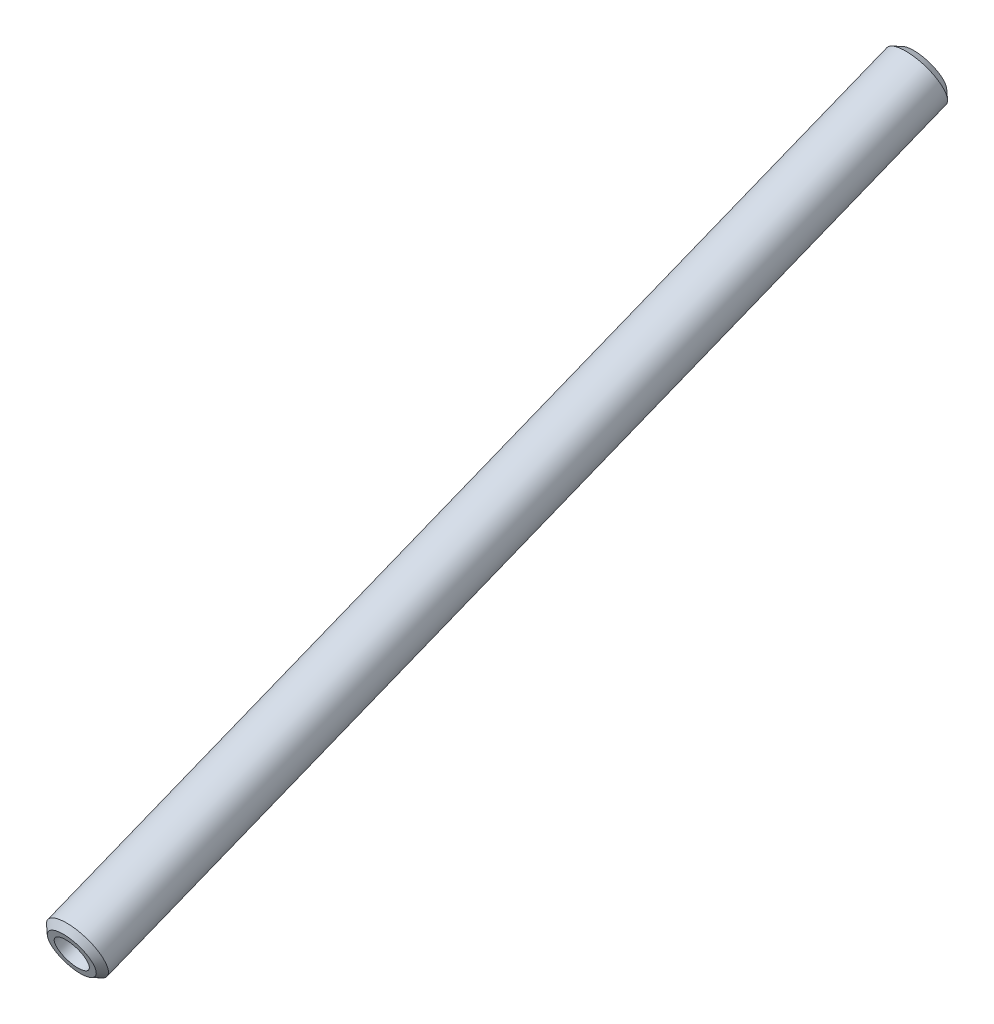
ISO-10303-21;
HEADER;
FILE_DESCRIPTION(('STEP AP214'),'2;1');
FILE_NAME('part.step','',(''),(''),'','','');
FILE_SCHEMA(('AUTOMOTIVE_DESIGN { 1 0 10303 214 1 1 1 1 }'));
ENDSEC;
DATA;
#1=APPLICATION_CONTEXT('core data for automotive mechanical design processes');
#2=APPLICATION_PROTOCOL_DEFINITION('international standard','automotive_design',2000,#1);
#3=PRODUCT_CONTEXT('',#1,'mechanical');
#4=PRODUCT('Part','Part','',(#3));
#5=PRODUCT_RELATED_PRODUCT_CATEGORY('part','',(#4));
#6=PRODUCT_DEFINITION_FORMATION('','',#4);
#7=PRODUCT_DEFINITION_CONTEXT('part definition',#1,'design');
#8=PRODUCT_DEFINITION('design','',#6,#7);
#9=PRODUCT_DEFINITION_SHAPE('','',#8);
#10=(LENGTH_UNIT() NAMED_UNIT(*) SI_UNIT(.MILLI.,.METRE.));
#11=(NAMED_UNIT(*) PLANE_ANGLE_UNIT() SI_UNIT($,.RADIAN.));
#12=(NAMED_UNIT(*) SI_UNIT($,.STERADIAN.) SOLID_ANGLE_UNIT());
#13=UNCERTAINTY_MEASURE_WITH_UNIT(LENGTH_MEASURE(1.E-05),#10,'distance_accuracy_value','');
#14=(GEOMETRIC_REPRESENTATION_CONTEXT(3) GLOBAL_UNCERTAINTY_ASSIGNED_CONTEXT((#13)) GLOBAL_UNIT_ASSIGNED_CONTEXT((#10,
#11,#12)) REPRESENTATION_CONTEXT('',''));
#15=CARTESIAN_POINT('',(0.,0.,0.));
#16=DIRECTION('',(0.,0.,1.));
#17=DIRECTION('',(1.,0.,0.));
#18=AXIS2_PLACEMENT_3D('',#15,#16,#17);
#19=CARTESIAN_POINT('',(1.75,14.1081767124824,62.1660185091115));
#20=DIRECTION('',(0.,0.371267808223223,-0.928525828707594));
#21=DIRECTION('',(0.,0.928525828707594,0.371267808223223));
#22=AXIS2_PLACEMENT_3D('',#19,#20,#21);
#23=PLANE('',#22);
#24=CARTESIAN_POINT('',(0.,14.1081767124825,62.1660185091115));
#25=DIRECTION('',(0.,-0.371267808223223,0.928525828707594));
#26=DIRECTION('',(0.,-0.928525828707594,-0.371267808223223));
#27=AXIS2_PLACEMENT_3D('',#24,#25,#26);
#28=CIRCLE('',#27,1.75);
#29=CARTESIAN_POINT('',(0.,12.4832565122442,61.5162998447208));
#30=VERTEX_POINT('',#29);
#31=EDGE_CURVE('E76',#30,#30,#28,.T.);
#32=ORIENTED_EDGE('',*,*,#31,.F.);
#33=EDGE_LOOP('',(#32));
#34=FACE_BOUND('',#33,.T.);
#35=CARTESIAN_POINT('',(0.,14.1081767124825,62.1660185091115));
#36=DIRECTION('',(0.,-0.371267808223223,0.928525828707594));
#37=DIRECTION('',(0.,-0.928525828707594,-0.371267808223223));
#38=AXIS2_PLACEMENT_3D('',#35,#36,#37);
#39=CIRCLE('',#38,2.7);
#40=CARTESIAN_POINT('',(0.,11.6011569749719,61.1635954269088));
#41=VERTEX_POINT('',#40);
#42=EDGE_CURVE('E55',#41,#41,#39,.T.);
#43=ORIENTED_EDGE('',*,*,#42,.T.);
#44=EDGE_LOOP('',(#43));
#45=FACE_BOUND('',#44,.T.);
#46=ADVANCED_FACE('F34',(#34,#45),#23,.F.);
#47=CARTESIAN_POINT('',(0.,0.,97.45));
#48=DIRECTION('',(0.,-0.371267808223223,0.928525828707594));
#49=DIRECTION('',(0.,-0.928525828707594,-0.371267808223223));
#50=AXIS2_PLACEMENT_3D('',#47,#48,#49);
#51=CYLINDRICAL_SURFACE('',#50,2.7);
#52=ORIENTED_EDGE('',*,*,#42,.F.);
#53=EDGE_LOOP('',(#52));
#54=FACE_BOUND('',#53,.T.);
#55=CARTESIAN_POINT('',(0.,11.1380342466967,69.5942251387722));
#56=DIRECTION('',(0.,-0.371267808223223,0.928525828707594));
#57=DIRECTION('',(0.,-0.928525828707594,-0.371267808223223));
#58=AXIS2_PLACEMENT_3D('',#55,#56,#57);
#59=CIRCLE('',#58,2.7);
#60=CARTESIAN_POINT('',(0.,8.63101450918616,68.5918020565695));
#61=VERTEX_POINT('',#60);
#62=EDGE_CURVE('E58',#61,#61,#59,.T.);
#63=ORIENTED_EDGE('',*,*,#62,.T.);
#64=EDGE_LOOP('',(#63));
#65=FACE_BOUND('',#64,.T.);
#66=ADVANCED_FACE('F84',(#54,#65),#51,.F.);
#67=CARTESIAN_POINT('',(4.76249999999998,11.1380342466967,69.5942251387722));
#68=DIRECTION('',(0.,0.371267808223223,-0.928525828707594));
#69=DIRECTION('',(0.,0.928525828707594,0.371267808223223));
#70=AXIS2_PLACEMENT_3D('',#67,#68,#69);
#71=PLANE('',#70);
#72=CARTESIAN_POINT('',(0.,11.1380342466967,69.5942251387722));
#73=DIRECTION('',(0.,0.371267808223223,-0.928525828707594));
#74=DIRECTION('',(0.,0.928525828707594,0.371267808223223));
#75=AXIS2_PLACEMENT_3D('',#72,#73,#74);
#76=CIRCLE('',#75,3.76249999999997);
#77=CARTESIAN_POINT('',(0.,14.631612677209,70.9911202672121));
#78=VERTEX_POINT('',#77);
#79=EDGE_CURVE('E10',#78,#78,#76,.F.);
#80=ORIENTED_EDGE('',*,*,#79,.T.);
#81=EDGE_LOOP('',(#80));
#82=FACE_BOUND('',#81,.T.);
#83=ORIENTED_EDGE('',*,*,#62,.F.);
#84=EDGE_LOOP('',(#83));
#85=FACE_BOUND('',#84,.T.);
#86=ADVANCED_FACE('F90',(#82,#85),#71,.F.);
#87=CARTESIAN_POINT('',(0.,0.,97.45));
#88=DIRECTION('',(0.,-0.371267808223223,0.928525828707594));
#89=DIRECTION('',(0.,-0.928525828707594,-0.371267808223223));
#90=AXIS2_PLACEMENT_3D('',#87,#88,#89);
#91=CYLINDRICAL_SURFACE('',#90,4.76249999999999);
#92=CARTESIAN_POINT('',(0.,66.4569376719569,-68.7561233386593));
#93=DIRECTION('',(0.,-0.371267808223229,0.928525828707592));
#94=DIRECTION('',(0.,-0.928525828707592,-0.371267808223229));
#95=AXIS2_PLACEMENT_3D('',#92,#93,#94);
#96=CIRCLE('',#95,4.76249999999999);
#97=CARTESIAN_POINT('',(0.,62.034833412737,-70.5242862753225));
#98=VERTEX_POINT('',#97);
#99=EDGE_CURVE('E46',#98,#98,#96,.T.);
#100=ORIENTED_EDGE('',*,*,#99,.T.);
#101=EDGE_LOOP('',(#100));
#102=FACE_BOUND('',#101,.T.);
#103=CARTESIAN_POINT('',(0.,11.5093020549199,68.6656993100646));
#104=DIRECTION('',(0.,0.371267808223221,-0.928525828707595));
#105=DIRECTION('',(0.,0.928525828707595,0.371267808223221));
#106=AXIS2_PLACEMENT_3D('',#103,#104,#105);
#107=CIRCLE('',#106,4.76249999999999);
#108=CARTESIAN_POINT('',(0.,15.9314063141398,70.4338622467277));
#109=VERTEX_POINT('',#108);
#110=EDGE_CURVE('E50',#109,#109,#107,.T.);
#111=ORIENTED_EDGE('',*,*,#110,.T.);
#112=EDGE_LOOP('',(#111));
#113=FACE_BOUND('',#112,.T.);
#114=ADVANCED_FACE('F95',(#102,#113),#91,.T.);
#115=CARTESIAN_POINT('',(2.70000000000002,66.8282054801801,-69.6846491673669));
#116=DIRECTION('',(0.,-0.371267808223223,0.928525828707594));
#117=DIRECTION('',(0.,-0.928525828707594,-0.371267808223223));
#118=AXIS2_PLACEMENT_3D('',#115,#116,#117);
#119=PLANE('',#118);
#120=CARTESIAN_POINT('',(0.,66.8282054801801,-69.6846491673669));
#121=DIRECTION('',(0.,-0.371267808223223,0.928525828707594));
#122=DIRECTION('',(0.,-0.928525828707594,-0.371267808223223));
#123=AXIS2_PLACEMENT_3D('',#120,#121,#122);
#124=CIRCLE('',#123,3.76250000000012);
#125=CARTESIAN_POINT('',(0.,63.3346270496676,-71.0815442958068));
#126=VERTEX_POINT('',#125);
#127=EDGE_CURVE('E42',#126,#126,#124,.F.);
#128=ORIENTED_EDGE('',*,*,#127,.T.);
#129=EDGE_LOOP('',(#128));
#130=FACE_BOUND('',#129,.T.);
#131=CARTESIAN_POINT('',(0.,66.8282054801801,-69.6846491673669));
#132=DIRECTION('',(0.,-0.371267808223223,0.928525828707594));
#133=DIRECTION('',(0.,-0.928525828707594,-0.371267808223223));
#134=AXIS2_PLACEMENT_3D('',#131,#132,#133);
#135=CIRCLE('',#134,2.70000000000002);
#136=CARTESIAN_POINT('',(0.,64.3211857426696,-70.6870722495696));
#137=VERTEX_POINT('',#136);
#138=EDGE_CURVE('E61',#137,#137,#135,.T.);
#139=ORIENTED_EDGE('',*,*,#138,.T.);
#140=EDGE_LOOP('',(#139));
#141=FACE_BOUND('',#140,.T.);
#142=ADVANCED_FACE('F101',(#130,#141),#119,.F.);
#143=CARTESIAN_POINT('',(0.,0.,97.45));
#144=DIRECTION('',(0.,-0.371267808223223,0.928525828707594));
#145=DIRECTION('',(0.,-0.928525828707594,-0.371267808223223));
#146=AXIS2_PLACEMENT_3D('',#143,#144,#145);
#147=CYLINDRICAL_SURFACE('',#146,2.70000000000002);
#148=ORIENTED_EDGE('',*,*,#138,.F.);
#149=EDGE_LOOP('',(#148));
#150=FACE_BOUND('',#149,.T.);
#151=CARTESIAN_POINT('',(0.,63.8580630143943,-62.2564425377061));
#152=DIRECTION('',(0.,-0.371267808223223,0.928525828707594));
#153=DIRECTION('',(0.,-0.928525828707594,-0.371267808223223));
#154=AXIS2_PLACEMENT_3D('',#151,#152,#153);
#155=CIRCLE('',#154,2.70000000000002);
#156=CARTESIAN_POINT('',(0.,61.3510432768838,-63.2588656199088));
#157=VERTEX_POINT('',#156);
#158=EDGE_CURVE('E64',#157,#157,#155,.T.);
#159=ORIENTED_EDGE('',*,*,#158,.T.);
#160=EDGE_LOOP('',(#159));
#161=FACE_BOUND('',#160,.T.);
#162=ADVANCED_FACE('F144',(#150,#161),#147,.F.);
#163=CARTESIAN_POINT('',(2.70000000000002,63.8580630143943,-62.2564425377061));
#164=DIRECTION('',(0.,-0.371267808223223,0.928525828707594));
#165=DIRECTION('',(0.,-0.928525828707594,-0.371267808223223));
#166=AXIS2_PLACEMENT_3D('',#163,#164,#165);
#167=PLANE('',#166);
#168=ORIENTED_EDGE('',*,*,#158,.F.);
#169=EDGE_LOOP('',(#168));
#170=FACE_BOUND('',#169,.T.);
#171=CARTESIAN_POINT('',(0.,63.8580630143943,-62.2564425377061));
#172=DIRECTION('',(0.,-0.371267808223223,0.928525828707594));
#173=DIRECTION('',(0.,-0.928525828707594,-0.371267808223223));
#174=AXIS2_PLACEMENT_3D('',#171,#172,#173);
#175=CIRCLE('',#174,1.75);
#176=CARTESIAN_POINT('',(0.,62.233142814156,-62.9061612020968));
#177=VERTEX_POINT('',#176);
#178=EDGE_CURVE('E67',#177,#177,#175,.T.);
#179=ORIENTED_EDGE('',*,*,#178,.T.);
#180=EDGE_LOOP('',(#179));
#181=FACE_BOUND('',#180,.T.);
#182=ADVANCED_FACE('F140',(#170,#181),#167,.F.);
#183=CARTESIAN_POINT('',(0.,0.,97.45));
#184=DIRECTION('',(0.,-0.371267808223223,0.928525828707594));
#185=DIRECTION('',(0.,-0.928525828707594,-0.371267808223223));
#186=AXIS2_PLACEMENT_3D('',#183,#184,#185);
#187=CYLINDRICAL_SURFACE('',#186,1.75);
#188=ORIENTED_EDGE('',*,*,#178,.F.);
#189=EDGE_LOOP('',(#188));
#190=FACE_BOUND('',#189,.T.);
#191=CARTESIAN_POINT('',(0.,61.2591883568317,-55.7567617367529));
#192=DIRECTION('',(0.,-0.371267808223223,0.928525828707594));
#193=DIRECTION('',(0.,-0.928525828707594,-0.371267808223223));
#194=AXIS2_PLACEMENT_3D('',#191,#192,#193);
#195=CIRCLE('',#194,1.75);
#196=CARTESIAN_POINT('',(0.,59.6342681565934,-56.4064804011436));
#197=VERTEX_POINT('',#196);
#198=EDGE_CURVE('E70',#197,#197,#195,.T.);
#199=ORIENTED_EDGE('',*,*,#198,.T.);
#200=EDGE_LOOP('',(#199));
#201=FACE_BOUND('',#200,.T.);
#202=ADVANCED_FACE('F136',(#190,#201),#187,.F.);
#203=CARTESIAN_POINT('',(0.,61.2591883568317,-55.7567617367529));
#204=DIRECTION('',(0.,-0.371267808223223,0.928525828707594));
#205=DIRECTION('',(0.,-0.928525828707594,-0.371267808223223));
#206=AXIS2_PLACEMENT_3D('',#203,#204,#205);
#207=PLANE('',#206);
#208=ORIENTED_EDGE('',*,*,#198,.F.);
#209=EDGE_LOOP('',(#208));
#210=FACE_BOUND('',#209,.T.);
#211=ADVANCED_FACE('F129',(#210),#207,.F.);
#212=CARTESIAN_POINT('',(1.75,16.707051370045,55.6663377081583));
#213=DIRECTION('',(0.,0.371267808223223,-0.928525828707594));
#214=DIRECTION('',(0.,0.928525828707594,0.371267808223223));
#215=AXIS2_PLACEMENT_3D('',#212,#213,#214);
#216=PLANE('',#215);
#217=CARTESIAN_POINT('',(0.,16.707051370045,55.6663377081583));
#218=DIRECTION('',(0.,-0.371267808223223,0.928525828707594));
#219=DIRECTION('',(0.,-0.928525828707594,-0.371267808223223));
#220=AXIS2_PLACEMENT_3D('',#217,#218,#219);
#221=CIRCLE('',#220,1.75);
#222=CARTESIAN_POINT('',(0.,15.0821311698067,55.0166190437677));
#223=VERTEX_POINT('',#222);
#224=EDGE_CURVE('E73',#223,#223,#221,.T.);
#225=ORIENTED_EDGE('',*,*,#224,.T.);
#226=EDGE_LOOP('',(#225));
#227=FACE_BOUND('',#226,.T.);
#228=ADVANCED_FACE('F117',(#227),#216,.F.);
#229=CARTESIAN_POINT('',(0.,0.,97.45));
#230=DIRECTION('',(0.,-0.371267808223223,0.928525828707594));
#231=DIRECTION('',(0.,-0.928525828707594,-0.371267808223223));
#232=AXIS2_PLACEMENT_3D('',#229,#230,#231);
#233=CYLINDRICAL_SURFACE('',#232,1.75);
#234=ORIENTED_EDGE('',*,*,#224,.F.);
#235=EDGE_LOOP('',(#234));
#236=FACE_BOUND('',#235,.T.);
#237=ORIENTED_EDGE('',*,*,#31,.T.);
#238=EDGE_LOOP('',(#237));
#239=FACE_BOUND('',#238,.T.);
#240=ADVANCED_FACE('F80',(#236,#239),#233,.F.);
#241=CARTESIAN_POINT('',(0.,66.4569376719569,-68.7561233386593));
#242=DIRECTION('',(0.,-0.371267808223229,0.928525828707592));
#243=DIRECTION('',(0.,-0.928525828707592,-0.371267808223229));
#244=AXIS2_PLACEMENT_3D('',#241,#242,#243);
#245=CONICAL_SURFACE('',#244,4.76249999999999,0.785398163397423);
#246=ORIENTED_EDGE('',*,*,#127,.F.);
#247=EDGE_LOOP('',(#246));
#248=FACE_BOUND('',#247,.T.);
#249=ORIENTED_EDGE('',*,*,#99,.F.);
#250=EDGE_LOOP('',(#249));
#251=FACE_BOUND('',#250,.T.);
#252=ADVANCED_FACE('F106',(#248,#251),#245,.T.);
#253=CARTESIAN_POINT('',(0.,11.1380342466967,69.5942251387722));
#254=DIRECTION('',(0.,0.371267808223221,-0.928525828707595));
#255=DIRECTION('',(0.,0.928525828707595,0.371267808223221));
#256=AXIS2_PLACEMENT_3D('',#253,#254,#255);
#257=CONICAL_SURFACE('',#256,3.76249999999996,0.785398163397453);
#258=ORIENTED_EDGE('',*,*,#110,.F.);
#259=EDGE_LOOP('',(#258));
#260=FACE_BOUND('',#259,.T.);
#261=ORIENTED_EDGE('',*,*,#79,.F.);
#262=EDGE_LOOP('',(#261));
#263=FACE_BOUND('',#262,.T.);
#264=ADVANCED_FACE('F37',(#260,#263),#257,.T.);
#265=CLOSED_SHELL('',(#46,#66,#86,#114,#142,#162,#182,#202,#211,#228,#240,#252,#264));
#266=MANIFOLD_SOLID_BREP('B2',#265);
#267=ADVANCED_BREP_SHAPE_REPRESENTATION('',(#18,#266),#14);
#268=SHAPE_DEFINITION_REPRESENTATION(#9,#267);
ENDSEC;
END-ISO-10303-21;
